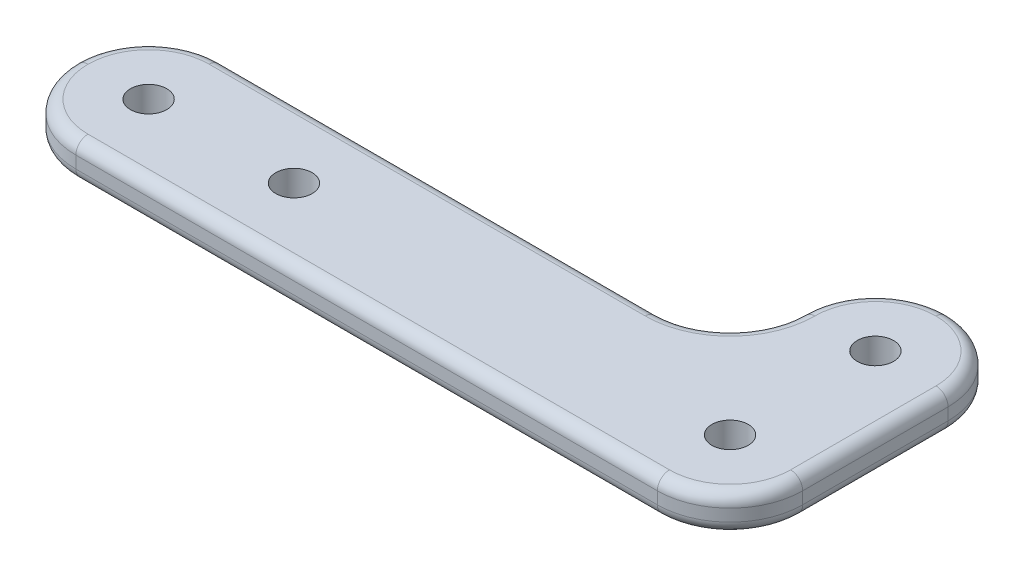
ISO-10303-21;
HEADER;
FILE_DESCRIPTION(('STEP AP214'),'2;1');
FILE_NAME('part.step','',(''),(''),'','','');
FILE_SCHEMA(('AUTOMOTIVE_DESIGN { 1 0 10303 214 1 1 1 1 }'));
ENDSEC;
DATA;
#1=APPLICATION_CONTEXT('core data for automotive mechanical design processes');
#2=APPLICATION_PROTOCOL_DEFINITION('international standard','automotive_design',2000,#1);
#3=PRODUCT_CONTEXT('',#1,'mechanical');
#4=PRODUCT('Part','Part','',(#3));
#5=PRODUCT_RELATED_PRODUCT_CATEGORY('part','',(#4));
#6=PRODUCT_DEFINITION_FORMATION('','',#4);
#7=PRODUCT_DEFINITION_CONTEXT('part definition',#1,'design');
#8=PRODUCT_DEFINITION('design','',#6,#7);
#9=PRODUCT_DEFINITION_SHAPE('','',#8);
#10=(LENGTH_UNIT() NAMED_UNIT(*) SI_UNIT(.MILLI.,.METRE.));
#11=(NAMED_UNIT(*) PLANE_ANGLE_UNIT() SI_UNIT($,.RADIAN.));
#12=(NAMED_UNIT(*) SI_UNIT($,.STERADIAN.) SOLID_ANGLE_UNIT());
#13=UNCERTAINTY_MEASURE_WITH_UNIT(LENGTH_MEASURE(1.E-05),#10,'distance_accuracy_value','');
#14=(GEOMETRIC_REPRESENTATION_CONTEXT(3) GLOBAL_UNCERTAINTY_ASSIGNED_CONTEXT((#13)) GLOBAL_UNIT_ASSIGNED_CONTEXT((#10,
#11,#12)) REPRESENTATION_CONTEXT('',''));
#15=CARTESIAN_POINT('',(0.,0.,0.));
#16=DIRECTION('',(0.,0.,1.));
#17=DIRECTION('',(1.,0.,0.));
#18=AXIS2_PLACEMENT_3D('',#15,#16,#17);
#19=CARTESIAN_POINT('',(0.,6.35,25.4));
#20=DIRECTION('',(0.,0.,-1.));
#21=DIRECTION('',(-1.,0.,0.));
#22=AXIS2_PLACEMENT_3D('',#19,#20,#21);
#23=PLANE('',#22);
#24=DIRECTION('',(0.,-1.,0.));
#25=VECTOR('',#24,1.);
#26=CARTESIAN_POINT('',(-101.6,6.35,25.4000000000004));
#27=LINE('',#26,#25);
#28=CARTESIAN_POINT('',(-101.6,4.23333333333333,25.4000000000004));
#29=VERTEX_POINT('',#28);
#30=CARTESIAN_POINT('',(-101.6,2.11666666666667,25.4000000000004));
#31=VERTEX_POINT('',#30);
#32=EDGE_CURVE('E187',#29,#31,#27,.T.);
#33=ORIENTED_EDGE('',*,*,#32,.T.);
#34=DIRECTION('',(1.,0.,0.));
#35=VECTOR('',#34,1.);
#36=CARTESIAN_POINT('',(0.,2.11666666666667,25.4));
#37=LINE('',#36,#35);
#38=CARTESIAN_POINT('',(0.,2.11666666666667,25.4));
#39=VERTEX_POINT('',#38);
#40=EDGE_CURVE('E233',#31,#39,#37,.T.);
#41=ORIENTED_EDGE('',*,*,#40,.T.);
#42=DIRECTION('',(0.,-1.,0.));
#43=VECTOR('',#42,1.);
#44=CARTESIAN_POINT('',(0.,6.35,25.4));
#45=LINE('',#44,#43);
#46=CARTESIAN_POINT('',(0.,4.23333333333333,25.4));
#47=VERTEX_POINT('',#46);
#48=EDGE_CURVE('E337',#47,#39,#45,.T.);
#49=ORIENTED_EDGE('',*,*,#48,.F.);
#50=DIRECTION('',(1.,0.,0.));
#51=VECTOR('',#50,1.);
#52=CARTESIAN_POINT('',(-101.6,4.23333333333333,25.4000000000004));
#53=LINE('',#52,#51);
#54=EDGE_CURVE('E231',#47,#29,#53,.F.);
#55=ORIENTED_EDGE('',*,*,#54,.T.);
#56=EDGE_LOOP('',(#33,#41,#49,#55));
#57=FACE_BOUND('',#56,.T.);
#58=ADVANCED_FACE('F35',(#57),#23,.F.);
#59=CARTESIAN_POINT('',(0.,6.35,12.7));
#60=DIRECTION('',(0.,-1.,0.));
#61=DIRECTION('',(0.,0.,-1.));
#62=AXIS2_PLACEMENT_3D('',#59,#60,#61);
#63=CYLINDRICAL_SURFACE('',#62,12.7);
#64=ORIENTED_EDGE('',*,*,#48,.T.);
#65=CARTESIAN_POINT('',(0.,2.11666666666667,12.7));
#66=DIRECTION('',(0.,1.,0.));
#67=DIRECTION('',(0.,0.,1.));
#68=AXIS2_PLACEMENT_3D('',#65,#66,#67);
#69=CIRCLE('',#68,12.7);
#70=CARTESIAN_POINT('',(12.7,2.11666666666667,12.7));
#71=VERTEX_POINT('',#70);
#72=EDGE_CURVE('E229',#39,#71,#69,.T.);
#73=ORIENTED_EDGE('',*,*,#72,.T.);
#74=DIRECTION('',(0.,-1.,0.));
#75=VECTOR('',#74,1.);
#76=CARTESIAN_POINT('',(12.7,6.35,12.7));
#77=LINE('',#76,#75);
#78=CARTESIAN_POINT('',(12.7,4.23333333333333,12.7));
#79=VERTEX_POINT('',#78);
#80=EDGE_CURVE('E341',#79,#71,#77,.T.);
#81=ORIENTED_EDGE('',*,*,#80,.F.);
#82=CARTESIAN_POINT('',(0.,4.23333333333333,12.7));
#83=DIRECTION('',(0.,1.,0.));
#84=DIRECTION('',(0.,0.,1.));
#85=AXIS2_PLACEMENT_3D('',#82,#83,#84);
#86=CIRCLE('',#85,12.7);
#87=EDGE_CURVE('E227',#79,#47,#86,.F.);
#88=ORIENTED_EDGE('',*,*,#87,.T.);
#89=EDGE_LOOP('',(#64,#73,#81,#88));
#90=FACE_BOUND('',#89,.T.);
#91=ADVANCED_FACE('F422',(#90),#63,.T.);
#92=CARTESIAN_POINT('',(12.7,6.35,0.));
#93=DIRECTION('',(-1.,0.,0.));
#94=DIRECTION('',(0.,0.,1.));
#95=AXIS2_PLACEMENT_3D('',#92,#93,#94);
#96=PLANE('',#95);
#97=ORIENTED_EDGE('',*,*,#80,.T.);
#98=DIRECTION('',(0.,0.,-1.));
#99=VECTOR('',#98,1.);
#100=CARTESIAN_POINT('',(12.7,2.11666666666667,0.));
#101=LINE('',#100,#99);
#102=CARTESIAN_POINT('',(12.7,2.11666666666667,-12.7));
#103=VERTEX_POINT('',#102);
#104=EDGE_CURVE('E225',#71,#103,#101,.T.);
#105=ORIENTED_EDGE('',*,*,#104,.T.);
#106=DIRECTION('',(0.,-1.,0.));
#107=VECTOR('',#106,1.);
#108=CARTESIAN_POINT('',(12.7,6.35,-12.7));
#109=LINE('',#108,#107);
#110=CARTESIAN_POINT('',(12.7,4.23333333333333,-12.7));
#111=VERTEX_POINT('',#110);
#112=EDGE_CURVE('E190',#103,#111,#109,.F.);
#113=ORIENTED_EDGE('',*,*,#112,.T.);
#114=DIRECTION('',(0.,0.,-1.));
#115=VECTOR('',#114,1.);
#116=CARTESIAN_POINT('',(12.7,4.23333333333333,12.7));
#117=LINE('',#116,#115);
#118=EDGE_CURVE('E223',#111,#79,#117,.F.);
#119=ORIENTED_EDGE('',*,*,#118,.T.);
#120=EDGE_LOOP('',(#97,#105,#113,#119));
#121=FACE_BOUND('',#120,.T.);
#122=ADVANCED_FACE('F428',(#121),#96,.F.);
#123=CARTESIAN_POINT('',(0.,6.35,0.));
#124=DIRECTION('',(0.,0.,1.));
#125=DIRECTION('',(1.,0.,0.));
#126=AXIS2_PLACEMENT_3D('',#123,#124,#125);
#127=PLANE('',#126);
#128=DIRECTION('',(0.,-1.,0.));
#129=VECTOR('',#128,1.);
#130=CARTESIAN_POINT('',(-25.3999999999999,6.35,0.));
#131=LINE('',#130,#129);
#132=CARTESIAN_POINT('',(-25.3999999999999,4.23333333333333,0.));
#133=VERTEX_POINT('',#132);
#134=CARTESIAN_POINT('',(-25.3999999999999,2.11666666666667,0.));
#135=VERTEX_POINT('',#134);
#136=EDGE_CURVE('E336',#133,#135,#131,.T.);
#137=ORIENTED_EDGE('',*,*,#136,.T.);
#138=DIRECTION('',(-1.,0.,0.));
#139=VECTOR('',#138,1.);
#140=CARTESIAN_POINT('',(0.,2.11666666666667,0.));
#141=LINE('',#140,#139);
#142=CARTESIAN_POINT('',(-101.6,2.11666666666667,3.49763620843824E-13));
#143=VERTEX_POINT('',#142);
#144=EDGE_CURVE('E11',#135,#143,#141,.T.);
#145=ORIENTED_EDGE('',*,*,#144,.T.);
#146=DIRECTION('',(0.,-1.,0.));
#147=VECTOR('',#146,1.);
#148=CARTESIAN_POINT('',(-101.6,6.35,3.49763620843824E-13));
#149=LINE('',#148,#147);
#150=CARTESIAN_POINT('',(-101.6,4.23333333333333,3.49763620843824E-13));
#151=VERTEX_POINT('',#150);
#152=EDGE_CURVE('E330',#143,#151,#149,.F.);
#153=ORIENTED_EDGE('',*,*,#152,.T.);
#154=DIRECTION('',(-1.,0.,0.));
#155=VECTOR('',#154,1.);
#156=CARTESIAN_POINT('',(-25.3999999999999,4.23333333333333,0.));
#157=LINE('',#156,#155);
#158=EDGE_CURVE('E44',#151,#133,#157,.F.);
#159=ORIENTED_EDGE('',*,*,#158,.T.);
#160=EDGE_LOOP('',(#137,#145,#153,#159));
#161=FACE_BOUND('',#160,.T.);
#162=ADVANCED_FACE('F334',(#161),#127,.F.);
#163=CARTESIAN_POINT('',(0.,6.35,-12.7));
#164=DIRECTION('',(0.,-1.,0.));
#165=DIRECTION('',(0.,0.,-1.));
#166=AXIS2_PLACEMENT_3D('',#163,#164,#165);
#167=CYLINDRICAL_SURFACE('',#166,3.175);
#168=CARTESIAN_POINT('',(0.,6.35,-12.7));
#169=DIRECTION('',(0.,1.,0.));
#170=DIRECTION('',(0.,0.,1.));
#171=AXIS2_PLACEMENT_3D('',#168,#169,#170);
#172=CIRCLE('',#171,3.175);
#173=CARTESIAN_POINT('',(0.,6.35,-9.52500000000002));
#174=VERTEX_POINT('',#173);
#175=EDGE_CURVE('E376',#174,#174,#172,.T.);
#176=ORIENTED_EDGE('',*,*,#175,.T.);
#177=EDGE_LOOP('',(#176));
#178=FACE_BOUND('',#177,.T.);
#179=CARTESIAN_POINT('',(0.,0.,-12.7));
#180=DIRECTION('',(0.,1.,0.));
#181=DIRECTION('',(0.,0.,1.));
#182=AXIS2_PLACEMENT_3D('',#179,#180,#181);
#183=CIRCLE('',#182,3.175);
#184=CARTESIAN_POINT('',(0.,0.,-9.52500000000002));
#185=VERTEX_POINT('',#184);
#186=EDGE_CURVE('E360',#185,#185,#183,.T.);
#187=ORIENTED_EDGE('',*,*,#186,.F.);
#188=EDGE_LOOP('',(#187));
#189=FACE_BOUND('',#188,.T.);
#190=ADVANCED_FACE('F402',(#178,#189),#167,.F.);
#191=CARTESIAN_POINT('',(-76.2,6.35,12.7000000000003));
#192=DIRECTION('',(0.,-1.,0.));
#193=DIRECTION('',(0.,0.,-1.));
#194=AXIS2_PLACEMENT_3D('',#191,#192,#193);
#195=CYLINDRICAL_SURFACE('',#194,3.175);
#196=CARTESIAN_POINT('',(-76.2,6.35,12.7000000000003));
#197=DIRECTION('',(0.,1.,0.));
#198=DIRECTION('',(0.,0.,1.));
#199=AXIS2_PLACEMENT_3D('',#196,#197,#198);
#200=CIRCLE('',#199,3.175);
#201=CARTESIAN_POINT('',(-76.2,6.35,15.8750000000003));
#202=VERTEX_POINT('',#201);
#203=EDGE_CURVE('E380',#202,#202,#200,.T.);
#204=ORIENTED_EDGE('',*,*,#203,.T.);
#205=EDGE_LOOP('',(#204));
#206=FACE_BOUND('',#205,.T.);
#207=CARTESIAN_POINT('',(-76.2,0.,12.7000000000003));
#208=DIRECTION('',(0.,1.,0.));
#209=DIRECTION('',(0.,0.,1.));
#210=AXIS2_PLACEMENT_3D('',#207,#208,#209);
#211=CIRCLE('',#210,3.175);
#212=CARTESIAN_POINT('',(-76.2,0.,15.8750000000003));
#213=VERTEX_POINT('',#212);
#214=EDGE_CURVE('E356',#213,#213,#211,.T.);
#215=ORIENTED_EDGE('',*,*,#214,.F.);
#216=EDGE_LOOP('',(#215));
#217=FACE_BOUND('',#216,.T.);
#218=ADVANCED_FACE('F399',(#206,#217),#195,.F.);
#219=CARTESIAN_POINT('',(-101.6,6.35,12.7000000000003));
#220=DIRECTION('',(0.,-1.,0.));
#221=DIRECTION('',(0.,0.,-1.));
#222=AXIS2_PLACEMENT_3D('',#219,#220,#221);
#223=CYLINDRICAL_SURFACE('',#222,3.1750000000001);
#224=CARTESIAN_POINT('',(-101.6,6.35,12.7000000000003));
#225=DIRECTION('',(0.,1.,0.));
#226=DIRECTION('',(0.,0.,1.));
#227=AXIS2_PLACEMENT_3D('',#224,#225,#226);
#228=CIRCLE('',#227,3.1750000000001);
#229=CARTESIAN_POINT('',(-101.6,6.35,15.8750000000004));
#230=VERTEX_POINT('',#229);
#231=EDGE_CURVE('E370',#230,#230,#228,.T.);
#232=ORIENTED_EDGE('',*,*,#231,.T.);
#233=EDGE_LOOP('',(#232));
#234=FACE_BOUND('',#233,.T.);
#235=CARTESIAN_POINT('',(-101.6,0.,12.7000000000003));
#236=DIRECTION('',(0.,1.,0.));
#237=DIRECTION('',(0.,0.,1.));
#238=AXIS2_PLACEMENT_3D('',#235,#236,#237);
#239=CIRCLE('',#238,3.1750000000001);
#240=CARTESIAN_POINT('',(-101.6,0.,15.8750000000004));
#241=VERTEX_POINT('',#240);
#242=EDGE_CURVE('E351',#241,#241,#239,.T.);
#243=ORIENTED_EDGE('',*,*,#242,.F.);
#244=EDGE_LOOP('',(#243));
#245=FACE_BOUND('',#244,.T.);
#246=ADVANCED_FACE('F389',(#234,#245),#223,.F.);
#247=CARTESIAN_POINT('',(0.,6.35,12.7));
#248=DIRECTION('',(0.,-1.,0.));
#249=DIRECTION('',(0.,0.,-1.));
#250=AXIS2_PLACEMENT_3D('',#247,#248,#249);
#251=CYLINDRICAL_SURFACE('',#250,3.175);
#252=CARTESIAN_POINT('',(0.,6.35,12.7));
#253=DIRECTION('',(0.,1.,0.));
#254=DIRECTION('',(0.,0.,1.));
#255=AXIS2_PLACEMENT_3D('',#252,#253,#254);
#256=CIRCLE('',#255,3.175);
#257=CARTESIAN_POINT('',(0.,6.35,15.875));
#258=VERTEX_POINT('',#257);
#259=EDGE_CURVE('E363',#258,#258,#256,.T.);
#260=ORIENTED_EDGE('',*,*,#259,.T.);
#261=EDGE_LOOP('',(#260));
#262=FACE_BOUND('',#261,.T.);
#263=CARTESIAN_POINT('',(0.,0.,12.7));
#264=DIRECTION('',(0.,1.,0.));
#265=DIRECTION('',(0.,0.,1.));
#266=AXIS2_PLACEMENT_3D('',#263,#264,#265);
#267=CIRCLE('',#266,3.175);
#268=CARTESIAN_POINT('',(0.,0.,15.875));
#269=VERTEX_POINT('',#268);
#270=EDGE_CURVE('E368',#269,#269,#267,.T.);
#271=ORIENTED_EDGE('',*,*,#270,.F.);
#272=EDGE_LOOP('',(#271));
#273=FACE_BOUND('',#272,.T.);
#274=ADVANCED_FACE('F393',(#262,#273),#251,.F.);
#275=CARTESIAN_POINT('',(0.,6.35,0.));
#276=DIRECTION('',(0.,1.,0.));
#277=DIRECTION('',(0.,0.,1.));
#278=AXIS2_PLACEMENT_3D('',#275,#276,#277);
#279=PLANE('',#278);
#280=CARTESIAN_POINT('',(0.,6.35,-12.7));
#281=DIRECTION('',(0.,1.,0.));
#282=DIRECTION('',(0.,0.,1.));
#283=AXIS2_PLACEMENT_3D('',#280,#281,#282);
#284=CIRCLE('',#283,10.5833333333333);
#285=CARTESIAN_POINT('',(0.,6.35,-23.2833333333334));
#286=VERTEX_POINT('',#285);
#287=CARTESIAN_POINT('',(-10.5833333333333,6.35,-12.7));
#288=VERTEX_POINT('',#287);
#289=EDGE_CURVE('E52',#286,#288,#284,.T.);
#290=ORIENTED_EDGE('',*,*,#289,.T.);
#291=CARTESIAN_POINT('',(-25.4,6.35,-12.6999999999999));
#292=DIRECTION('',(0.,1.,0.));
#293=DIRECTION('',(0.,0.,1.));
#294=AXIS2_PLACEMENT_3D('',#291,#292,#293);
#295=CIRCLE('',#294,14.8166666666667);
#296=CARTESIAN_POINT('',(-25.3999999999999,6.35,2.11666666666674));
#297=VERTEX_POINT('',#296);
#298=EDGE_CURVE('E256',#288,#297,#295,.F.);
#299=ORIENTED_EDGE('',*,*,#298,.T.);
#300=DIRECTION('',(-1.,0.,0.));
#301=VECTOR('',#300,1.);
#302=CARTESIAN_POINT('',(-101.6,6.35,2.11666666666702));
#303=LINE('',#302,#301);
#304=CARTESIAN_POINT('',(-101.6,6.35,2.11666666666702));
#305=VERTEX_POINT('',#304);
#306=EDGE_CURVE('E242',#297,#305,#303,.T.);
#307=ORIENTED_EDGE('',*,*,#306,.T.);
#308=CARTESIAN_POINT('',(-101.6,6.35,12.7000000000003));
#309=DIRECTION('',(0.,1.,0.));
#310=DIRECTION('',(0.,0.,1.));
#311=AXIS2_PLACEMENT_3D('',#308,#309,#310);
#312=CIRCLE('',#311,10.5833333333333);
#313=CARTESIAN_POINT('',(-112.183333333333,6.35,12.7000000000004));
#314=VERTEX_POINT('',#313);
#315=EDGE_CURVE('E244',#305,#314,#312,.T.);
#316=ORIENTED_EDGE('',*,*,#315,.T.);
#317=CARTESIAN_POINT('',(-101.6,6.35,12.7000000000003));
#318=DIRECTION('',(0.,1.,0.));
#319=DIRECTION('',(0.,0.,1.));
#320=AXIS2_PLACEMENT_3D('',#317,#318,#319);
#321=CIRCLE('',#320,10.5833333333333);
#322=CARTESIAN_POINT('',(-101.6,6.35,23.2833333333337));
#323=VERTEX_POINT('',#322);
#324=EDGE_CURVE('E246',#314,#323,#321,.T.);
#325=ORIENTED_EDGE('',*,*,#324,.T.);
#326=DIRECTION('',(1.,0.,0.));
#327=VECTOR('',#326,1.);
#328=CARTESIAN_POINT('',(0.,6.35,23.2833333333333));
#329=LINE('',#328,#327);
#330=CARTESIAN_POINT('',(0.,6.35,23.2833333333333));
#331=VERTEX_POINT('',#330);
#332=EDGE_CURVE('E248',#323,#331,#329,.T.);
#333=ORIENTED_EDGE('',*,*,#332,.T.);
#334=CARTESIAN_POINT('',(0.,6.35,12.7));
#335=DIRECTION('',(0.,1.,0.));
#336=DIRECTION('',(0.,0.,1.));
#337=AXIS2_PLACEMENT_3D('',#334,#335,#336);
#338=CIRCLE('',#337,10.5833333333333);
#339=CARTESIAN_POINT('',(10.5833333333333,6.35,12.7));
#340=VERTEX_POINT('',#339);
#341=EDGE_CURVE('E250',#331,#340,#338,.T.);
#342=ORIENTED_EDGE('',*,*,#341,.T.);
#343=DIRECTION('',(0.,0.,-1.));
#344=VECTOR('',#343,1.);
#345=CARTESIAN_POINT('',(10.5833333333333,6.35,-12.7));
#346=LINE('',#345,#344);
#347=CARTESIAN_POINT('',(10.5833333333333,6.35,-12.7));
#348=VERTEX_POINT('',#347);
#349=EDGE_CURVE('E252',#340,#348,#346,.T.);
#350=ORIENTED_EDGE('',*,*,#349,.T.);
#351=CARTESIAN_POINT('',(0.,6.35,-12.7));
#352=DIRECTION('',(0.,1.,0.));
#353=DIRECTION('',(0.,0.,1.));
#354=AXIS2_PLACEMENT_3D('',#351,#352,#353);
#355=CIRCLE('',#354,10.5833333333333);
#356=EDGE_CURVE('E57',#348,#286,#355,.T.);
#357=ORIENTED_EDGE('',*,*,#356,.T.);
#358=EDGE_LOOP('',(#290,#299,#307,#316,#325,#333,#342,#350,#357));
#359=FACE_BOUND('',#358,.T.);
#360=ORIENTED_EDGE('',*,*,#231,.F.);
#361=EDGE_LOOP('',(#360));
#362=FACE_BOUND('',#361,.T.);
#363=ORIENTED_EDGE('',*,*,#203,.F.);
#364=EDGE_LOOP('',(#363));
#365=FACE_BOUND('',#364,.T.);
#366=ORIENTED_EDGE('',*,*,#175,.F.);
#367=EDGE_LOOP('',(#366));
#368=FACE_BOUND('',#367,.T.);
#369=ORIENTED_EDGE('',*,*,#259,.F.);
#370=EDGE_LOOP('',(#369));
#371=FACE_BOUND('',#370,.T.);
#372=ADVANCED_FACE('F311',(#359,#362,#365,#368,#371),#279,.T.);
#373=CARTESIAN_POINT('',(0.,0.,0.));
#374=DIRECTION('',(0.,1.,0.));
#375=DIRECTION('',(0.,0.,1.));
#376=AXIS2_PLACEMENT_3D('',#373,#374,#375);
#377=PLANE('',#376);
#378=DIRECTION('',(-1.,0.,0.));
#379=VECTOR('',#378,1.);
#380=CARTESIAN_POINT('',(0.,0.,2.11666666666665));
#381=LINE('',#380,#379);
#382=CARTESIAN_POINT('',(-101.6,0.,2.11666666666702));
#383=VERTEX_POINT('',#382);
#384=CARTESIAN_POINT('',(-25.3999999999999,0.,2.11666666666674));
#385=VERTEX_POINT('',#384);
#386=EDGE_CURVE('E166',#383,#385,#381,.F.);
#387=ORIENTED_EDGE('',*,*,#386,.T.);
#388=CARTESIAN_POINT('',(-25.4,0.,-12.6999999999999));
#389=DIRECTION('',(0.,1.,0.));
#390=DIRECTION('',(0.,0.,1.));
#391=AXIS2_PLACEMENT_3D('',#388,#389,#390);
#392=CIRCLE('',#391,14.8166666666667);
#393=CARTESIAN_POINT('',(-10.5833333333333,0.,-12.7));
#394=VERTEX_POINT('',#393);
#395=EDGE_CURVE('E207',#385,#394,#392,.T.);
#396=ORIENTED_EDGE('',*,*,#395,.T.);
#397=CARTESIAN_POINT('',(0.,0.,-12.7));
#398=DIRECTION('',(0.,1.,0.));
#399=DIRECTION('',(0.,0.,1.));
#400=AXIS2_PLACEMENT_3D('',#397,#398,#399);
#401=CIRCLE('',#400,10.5833333333333);
#402=CARTESIAN_POINT('',(0.,0.,-23.2833333333334));
#403=VERTEX_POINT('',#402);
#404=EDGE_CURVE('E205',#394,#403,#401,.F.);
#405=ORIENTED_EDGE('',*,*,#404,.T.);
#406=CARTESIAN_POINT('',(0.,0.,-12.7));
#407=DIRECTION('',(0.,1.,0.));
#408=DIRECTION('',(0.,0.,1.));
#409=AXIS2_PLACEMENT_3D('',#406,#407,#408);
#410=CIRCLE('',#409,10.5833333333333);
#411=CARTESIAN_POINT('',(10.5833333333333,0.,-12.7));
#412=VERTEX_POINT('',#411);
#413=EDGE_CURVE('E203',#403,#412,#410,.F.);
#414=ORIENTED_EDGE('',*,*,#413,.T.);
#415=DIRECTION('',(0.,0.,-1.));
#416=VECTOR('',#415,1.);
#417=CARTESIAN_POINT('',(10.5833333333333,0.,0.));
#418=LINE('',#417,#416);
#419=CARTESIAN_POINT('',(10.5833333333333,0.,12.7));
#420=VERTEX_POINT('',#419);
#421=EDGE_CURVE('E201',#412,#420,#418,.F.);
#422=ORIENTED_EDGE('',*,*,#421,.T.);
#423=CARTESIAN_POINT('',(0.,0.,12.7));
#424=DIRECTION('',(0.,1.,0.));
#425=DIRECTION('',(0.,0.,1.));
#426=AXIS2_PLACEMENT_3D('',#423,#424,#425);
#427=CIRCLE('',#426,10.5833333333333);
#428=CARTESIAN_POINT('',(0.,0.,23.2833333333333));
#429=VERTEX_POINT('',#428);
#430=EDGE_CURVE('E199',#420,#429,#427,.F.);
#431=ORIENTED_EDGE('',*,*,#430,.T.);
#432=DIRECTION('',(1.,0.,0.));
#433=VECTOR('',#432,1.);
#434=CARTESIAN_POINT('',(0.,0.,23.2833333333333));
#435=LINE('',#434,#433);
#436=CARTESIAN_POINT('',(-101.6,0.,23.2833333333337));
#437=VERTEX_POINT('',#436);
#438=EDGE_CURVE('E197',#429,#437,#435,.F.);
#439=ORIENTED_EDGE('',*,*,#438,.T.);
#440=CARTESIAN_POINT('',(-101.6,0.,12.7000000000003));
#441=DIRECTION('',(0.,1.,0.));
#442=DIRECTION('',(0.,0.,1.));
#443=AXIS2_PLACEMENT_3D('',#440,#441,#442);
#444=CIRCLE('',#443,10.5833333333333);
#445=CARTESIAN_POINT('',(-112.183333333333,0.,12.7000000000004));
#446=VERTEX_POINT('',#445);
#447=EDGE_CURVE('E169',#437,#446,#444,.F.);
#448=ORIENTED_EDGE('',*,*,#447,.T.);
#449=CARTESIAN_POINT('',(-101.6,0.,12.7000000000003));
#450=DIRECTION('',(0.,1.,0.));
#451=DIRECTION('',(0.,0.,1.));
#452=AXIS2_PLACEMENT_3D('',#449,#450,#451);
#453=CIRCLE('',#452,10.5833333333333);
#454=EDGE_CURVE('E160',#446,#383,#453,.F.);
#455=ORIENTED_EDGE('',*,*,#454,.T.);
#456=EDGE_LOOP('',(#387,#396,#405,#414,#422,#431,#439,#448,#455));
#457=FACE_BOUND('',#456,.T.);
#458=ORIENTED_EDGE('',*,*,#242,.T.);
#459=EDGE_LOOP('',(#458));
#460=FACE_BOUND('',#459,.T.);
#461=ORIENTED_EDGE('',*,*,#214,.T.);
#462=EDGE_LOOP('',(#461));
#463=FACE_BOUND('',#462,.T.);
#464=ORIENTED_EDGE('',*,*,#186,.T.);
#465=EDGE_LOOP('',(#464));
#466=FACE_BOUND('',#465,.T.);
#467=ORIENTED_EDGE('',*,*,#270,.T.);
#468=EDGE_LOOP('',(#467));
#469=FACE_BOUND('',#468,.T.);
#470=ADVANCED_FACE('F162',(#457,#460,#463,#466,#469),#377,.F.);
#471=CARTESIAN_POINT('',(0.,6.35,-12.7));
#472=DIRECTION('',(0.,1.,0.));
#473=DIRECTION('',(0.,0.,1.));
#474=AXIS2_PLACEMENT_3D('',#471,#472,#473);
#475=CYLINDRICAL_SURFACE('',#474,12.7);
#476=ORIENTED_EDGE('',*,*,#112,.F.);
#477=CARTESIAN_POINT('',(0.,2.11666666666667,-12.7));
#478=DIRECTION('',(0.,1.,0.));
#479=DIRECTION('',(0.,0.,1.));
#480=AXIS2_PLACEMENT_3D('',#477,#478,#479);
#481=CIRCLE('',#480,12.7);
#482=CARTESIAN_POINT('',(0.,2.11666666666667,-25.4));
#483=VERTEX_POINT('',#482);
#484=EDGE_CURVE('E221',#103,#483,#481,.T.);
#485=ORIENTED_EDGE('',*,*,#484,.T.);
#486=DIRECTION('',(0.,-1.,0.));
#487=VECTOR('',#486,1.);
#488=CARTESIAN_POINT('',(0.,0.,-25.4));
#489=LINE('',#488,#487);
#490=CARTESIAN_POINT('',(0.,4.23333333333333,-25.4));
#491=VERTEX_POINT('',#490);
#492=EDGE_CURVE('E349',#491,#483,#489,.T.);
#493=ORIENTED_EDGE('',*,*,#492,.F.);
#494=CARTESIAN_POINT('',(0.,4.23333333333333,-12.7));
#495=DIRECTION('',(0.,1.,0.));
#496=DIRECTION('',(0.,0.,1.));
#497=AXIS2_PLACEMENT_3D('',#494,#495,#496);
#498=CIRCLE('',#497,12.7);
#499=EDGE_CURVE('E219',#491,#111,#498,.F.);
#500=ORIENTED_EDGE('',*,*,#499,.T.);
#501=EDGE_LOOP('',(#476,#485,#493,#500));
#502=FACE_BOUND('',#501,.T.);
#503=ADVANCED_FACE('F408',(#502),#475,.T.);
#504=CARTESIAN_POINT('',(0.,6.35,-12.7));
#505=DIRECTION('',(0.,-1.,0.));
#506=DIRECTION('',(0.,0.,-1.));
#507=AXIS2_PLACEMENT_3D('',#504,#505,#506);
#508=CYLINDRICAL_SURFACE('',#507,12.7);
#509=ORIENTED_EDGE('',*,*,#492,.T.);
#510=CARTESIAN_POINT('',(0.,2.11666666666667,-12.7));
#511=DIRECTION('',(0.,1.,0.));
#512=DIRECTION('',(0.,0.,1.));
#513=AXIS2_PLACEMENT_3D('',#510,#511,#512);
#514=CIRCLE('',#513,12.7);
#515=CARTESIAN_POINT('',(-12.7,2.11666666666667,-12.7));
#516=VERTEX_POINT('',#515);
#517=EDGE_CURVE('E217',#483,#516,#514,.T.);
#518=ORIENTED_EDGE('',*,*,#517,.T.);
#519=DIRECTION('',(0.,-1.,0.));
#520=VECTOR('',#519,1.);
#521=CARTESIAN_POINT('',(-12.7,6.35,-12.7));
#522=LINE('',#521,#520);
#523=CARTESIAN_POINT('',(-12.7,4.23333333333333,-12.7));
#524=VERTEX_POINT('',#523);
#525=EDGE_CURVE('E347',#524,#516,#522,.T.);
#526=ORIENTED_EDGE('',*,*,#525,.F.);
#527=CARTESIAN_POINT('',(0.,4.23333333333333,-12.7));
#528=DIRECTION('',(0.,1.,0.));
#529=DIRECTION('',(0.,0.,1.));
#530=AXIS2_PLACEMENT_3D('',#527,#528,#529);
#531=CIRCLE('',#530,12.7);
#532=EDGE_CURVE('E215',#524,#491,#531,.F.);
#533=ORIENTED_EDGE('',*,*,#532,.T.);
#534=EDGE_LOOP('',(#509,#518,#526,#533));
#535=FACE_BOUND('',#534,.T.);
#536=ADVANCED_FACE('F437',(#535),#508,.T.);
#537=CARTESIAN_POINT('',(-25.4,6.35,-12.6999999999999));
#538=DIRECTION('',(0.,-1.,0.));
#539=DIRECTION('',(0.,0.,-1.));
#540=AXIS2_PLACEMENT_3D('',#537,#538,#539);
#541=CYLINDRICAL_SURFACE('',#540,12.7);
#542=ORIENTED_EDGE('',*,*,#525,.T.);
#543=CARTESIAN_POINT('',(-25.4,2.11666666666667,-12.6999999999999));
#544=DIRECTION('',(0.,1.,0.));
#545=DIRECTION('',(0.,0.,1.));
#546=AXIS2_PLACEMENT_3D('',#543,#544,#545);
#547=CIRCLE('',#546,12.7);
#548=EDGE_CURVE('E212',#516,#135,#547,.F.);
#549=ORIENTED_EDGE('',*,*,#548,.T.);
#550=ORIENTED_EDGE('',*,*,#136,.F.);
#551=CARTESIAN_POINT('',(-25.4,4.23333333333333,-12.6999999999999));
#552=DIRECTION('',(0.,1.,0.));
#553=DIRECTION('',(0.,0.,1.));
#554=AXIS2_PLACEMENT_3D('',#551,#552,#553);
#555=CIRCLE('',#554,12.7);
#556=EDGE_CURVE('E209',#133,#524,#555,.T.);
#557=ORIENTED_EDGE('',*,*,#556,.T.);
#558=EDGE_LOOP('',(#542,#549,#550,#557));
#559=FACE_BOUND('',#558,.T.);
#560=ADVANCED_FACE('F433',(#559),#541,.F.);
#561=CARTESIAN_POINT('',(-101.6,6.35,12.7000000000003));
#562=DIRECTION('',(0.,-1.,0.));
#563=DIRECTION('',(0.,0.,-1.));
#564=AXIS2_PLACEMENT_3D('',#561,#562,#563);
#565=CYLINDRICAL_SURFACE('',#564,12.7);
#566=DIRECTION('',(0.,-1.,0.));
#567=VECTOR('',#566,1.);
#568=CARTESIAN_POINT('',(-114.3,6.35,12.7000000000004));
#569=LINE('',#568,#567);
#570=CARTESIAN_POINT('',(-114.3,2.11666666666667,12.7000000000004));
#571=VERTEX_POINT('',#570);
#572=CARTESIAN_POINT('',(-114.3,4.23333333333333,12.7000000000004));
#573=VERTEX_POINT('',#572);
#574=EDGE_CURVE('E193',#571,#573,#569,.F.);
#575=ORIENTED_EDGE('',*,*,#574,.F.);
#576=CARTESIAN_POINT('',(-101.6,2.11666666666667,12.7000000000003));
#577=DIRECTION('',(0.,1.,0.));
#578=DIRECTION('',(0.,0.,1.));
#579=AXIS2_PLACEMENT_3D('',#576,#577,#578);
#580=CIRCLE('',#579,12.7);
#581=EDGE_CURVE('E237',#571,#31,#580,.T.);
#582=ORIENTED_EDGE('',*,*,#581,.T.);
#583=ORIENTED_EDGE('',*,*,#32,.F.);
#584=CARTESIAN_POINT('',(-101.6,4.23333333333333,12.7000000000003));
#585=DIRECTION('',(0.,1.,0.));
#586=DIRECTION('',(0.,0.,1.));
#587=AXIS2_PLACEMENT_3D('',#584,#585,#586);
#588=CIRCLE('',#587,12.7);
#589=EDGE_CURVE('E235',#29,#573,#588,.F.);
#590=ORIENTED_EDGE('',*,*,#589,.T.);
#591=EDGE_LOOP('',(#575,#582,#583,#590));
#592=FACE_BOUND('',#591,.T.);
#593=ADVANCED_FACE('F436',(#592),#565,.T.);
#594=CARTESIAN_POINT('',(-101.6,6.35,12.7000000000003));
#595=DIRECTION('',(0.,-1.,0.));
#596=DIRECTION('',(0.,0.,-1.));
#597=AXIS2_PLACEMENT_3D('',#594,#595,#596);
#598=CYLINDRICAL_SURFACE('',#597,12.7);
#599=ORIENTED_EDGE('',*,*,#152,.F.);
#600=CARTESIAN_POINT('',(-101.6,2.11666666666667,12.7000000000003));
#601=DIRECTION('',(0.,1.,0.));
#602=DIRECTION('',(0.,0.,1.));
#603=AXIS2_PLACEMENT_3D('',#600,#601,#602);
#604=CIRCLE('',#603,12.7);
#605=EDGE_CURVE('E178',#143,#571,#604,.T.);
#606=ORIENTED_EDGE('',*,*,#605,.T.);
#607=ORIENTED_EDGE('',*,*,#574,.T.);
#608=CARTESIAN_POINT('',(-101.6,4.23333333333333,12.7000000000003));
#609=DIRECTION('',(0.,1.,0.));
#610=DIRECTION('',(0.,0.,1.));
#611=AXIS2_PLACEMENT_3D('',#608,#609,#610);
#612=CIRCLE('',#611,12.7);
#613=EDGE_CURVE('E239',#573,#151,#612,.F.);
#614=ORIENTED_EDGE('',*,*,#613,.T.);
#615=EDGE_LOOP('',(#599,#606,#607,#614));
#616=FACE_BOUND('',#615,.T.);
#617=ADVANCED_FACE('F329',(#616),#598,.T.);
#618=CARTESIAN_POINT('',(0.,2.11666666666667,23.2833333333333));
#619=DIRECTION('',(1.,0.,0.));
#620=DIRECTION('',(0.,0.,-1.));
#621=AXIS2_PLACEMENT_3D('',#618,#619,#620);
#622=CYLINDRICAL_SURFACE('',#621,2.11666666666667);
#623=CARTESIAN_POINT('',(-101.6,2.11666666666667,23.2833333333337));
#624=DIRECTION('',(-1.,0.,0.));
#625=DIRECTION('',(0.,0.,1.));
#626=AXIS2_PLACEMENT_3D('',#623,#624,#625);
#627=CIRCLE('',#626,2.11666666666667);
#628=EDGE_CURVE('E271',#437,#31,#627,.T.);
#629=ORIENTED_EDGE('',*,*,#628,.F.);
#630=ORIENTED_EDGE('',*,*,#438,.F.);
#631=CARTESIAN_POINT('',(0.,2.11666666666667,23.2833333333333));
#632=DIRECTION('',(1.,0.,0.));
#633=DIRECTION('',(0.,0.,-1.));
#634=AXIS2_PLACEMENT_3D('',#631,#632,#633);
#635=CIRCLE('',#634,2.11666666666667);
#636=EDGE_CURVE('E274',#39,#429,#635,.T.);
#637=ORIENTED_EDGE('',*,*,#636,.F.);
#638=ORIENTED_EDGE('',*,*,#40,.F.);
#639=EDGE_LOOP('',(#629,#630,#637,#638));
#640=FACE_BOUND('',#639,.T.);
#641=ADVANCED_FACE('F446',(#640),#622,.T.);
#642=CARTESIAN_POINT('',(0.,2.11666666666667,12.7));
#643=DIRECTION('',(0.,1.,0.));
#644=DIRECTION('',(0.,0.,1.));
#645=AXIS2_PLACEMENT_3D('',#642,#643,#644);
#646=TOROIDAL_SURFACE('',#645,10.5833333333333,2.11666666666667);
#647=ORIENTED_EDGE('',*,*,#636,.T.);
#648=ORIENTED_EDGE('',*,*,#430,.F.);
#649=CARTESIAN_POINT('',(10.5833333333333,2.11666666666667,12.7));
#650=DIRECTION('',(0.,0.,-1.));
#651=DIRECTION('',(-1.,0.,0.));
#652=AXIS2_PLACEMENT_3D('',#649,#650,#651);
#653=CIRCLE('',#652,2.11666666666667);
#654=EDGE_CURVE('E268',#71,#420,#653,.T.);
#655=ORIENTED_EDGE('',*,*,#654,.F.);
#656=ORIENTED_EDGE('',*,*,#72,.F.);
#657=EDGE_LOOP('',(#647,#648,#655,#656));
#658=FACE_BOUND('',#657,.T.);
#659=ADVANCED_FACE('F473',(#658),#646,.T.);
#660=CARTESIAN_POINT('',(-101.6,2.11666666666667,12.7000000000003));
#661=DIRECTION('',(0.,1.,0.));
#662=DIRECTION('',(0.,0.,1.));
#663=AXIS2_PLACEMENT_3D('',#660,#661,#662);
#664=TOROIDAL_SURFACE('',#663,10.5833333333333,2.11666666666667);
#665=ORIENTED_EDGE('',*,*,#628,.T.);
#666=ORIENTED_EDGE('',*,*,#581,.F.);
#667=CARTESIAN_POINT('',(-112.183333333333,2.11666666666667,12.7000000000004));
#668=DIRECTION('',(0.,0.,-1.));
#669=DIRECTION('',(-1.,0.,0.));
#670=AXIS2_PLACEMENT_3D('',#667,#668,#669);
#671=CIRCLE('',#670,2.11666666666667);
#672=EDGE_CURVE('E266',#446,#571,#671,.T.);
#673=ORIENTED_EDGE('',*,*,#672,.F.);
#674=ORIENTED_EDGE('',*,*,#447,.F.);
#675=EDGE_LOOP('',(#665,#666,#673,#674));
#676=FACE_BOUND('',#675,.T.);
#677=ADVANCED_FACE('F469',(#676),#664,.T.);
#678=CARTESIAN_POINT('',(10.5833333333333,2.11666666666667,0.));
#679=DIRECTION('',(0.,0.,-1.));
#680=DIRECTION('',(-1.,0.,0.));
#681=AXIS2_PLACEMENT_3D('',#678,#679,#680);
#682=CYLINDRICAL_SURFACE('',#681,2.11666666666667);
#683=ORIENTED_EDGE('',*,*,#654,.T.);
#684=ORIENTED_EDGE('',*,*,#421,.F.);
#685=CARTESIAN_POINT('',(10.5833333333333,2.11666666666667,-12.7));
#686=DIRECTION('',(0.,0.,-1.));
#687=DIRECTION('',(-1.,0.,0.));
#688=AXIS2_PLACEMENT_3D('',#685,#686,#687);
#689=CIRCLE('',#688,2.11666666666667);
#690=EDGE_CURVE('E181',#103,#412,#689,.T.);
#691=ORIENTED_EDGE('',*,*,#690,.F.);
#692=ORIENTED_EDGE('',*,*,#104,.F.);
#693=EDGE_LOOP('',(#683,#684,#691,#692));
#694=FACE_BOUND('',#693,.T.);
#695=ADVANCED_FACE('F466',(#694),#682,.T.);
#696=CARTESIAN_POINT('',(-101.6,2.11666666666667,12.7000000000003));
#697=DIRECTION('',(0.,1.,0.));
#698=DIRECTION('',(0.,0.,1.));
#699=AXIS2_PLACEMENT_3D('',#696,#697,#698);
#700=TOROIDAL_SURFACE('',#699,10.5833333333333,2.11666666666667);
#701=ORIENTED_EDGE('',*,*,#672,.T.);
#702=ORIENTED_EDGE('',*,*,#605,.F.);
#703=CARTESIAN_POINT('',(-101.6,2.11666666666667,2.11666666666702));
#704=DIRECTION('',(1.,0.,0.));
#705=DIRECTION('',(0.,0.,-1.));
#706=AXIS2_PLACEMENT_3D('',#703,#704,#705);
#707=CIRCLE('',#706,2.11666666666667);
#708=EDGE_CURVE('E176',#383,#143,#707,.T.);
#709=ORIENTED_EDGE('',*,*,#708,.F.);
#710=ORIENTED_EDGE('',*,*,#454,.F.);
#711=EDGE_LOOP('',(#701,#702,#709,#710));
#712=FACE_BOUND('',#711,.T.);
#713=ADVANCED_FACE('F177',(#712),#700,.T.);
#714=CARTESIAN_POINT('',(0.,2.11666666666667,-12.7));
#715=DIRECTION('',(0.,1.,0.));
#716=DIRECTION('',(0.,0.,1.));
#717=AXIS2_PLACEMENT_3D('',#714,#715,#716);
#718=TOROIDAL_SURFACE('',#717,10.5833333333333,2.11666666666667);
#719=ORIENTED_EDGE('',*,*,#690,.T.);
#720=ORIENTED_EDGE('',*,*,#413,.F.);
#721=CARTESIAN_POINT('',(0.,2.11666666666667,-23.2833333333334));
#722=DIRECTION('',(-1.,0.,0.));
#723=DIRECTION('',(0.,-1.,0.));
#724=AXIS2_PLACEMENT_3D('',#721,#722,#723);
#725=CIRCLE('',#724,2.11666666666667);
#726=EDGE_CURVE('E182',#483,#403,#725,.T.);
#727=ORIENTED_EDGE('',*,*,#726,.F.);
#728=ORIENTED_EDGE('',*,*,#484,.F.);
#729=EDGE_LOOP('',(#719,#720,#727,#728));
#730=FACE_BOUND('',#729,.T.);
#731=ADVANCED_FACE('F460',(#730),#718,.T.);
#732=CARTESIAN_POINT('',(0.,2.11666666666667,2.11666666666665));
#733=DIRECTION('',(-1.,0.,0.));
#734=DIRECTION('',(0.,0.,1.));
#735=AXIS2_PLACEMENT_3D('',#732,#733,#734);
#736=CYLINDRICAL_SURFACE('',#735,2.11666666666667);
#737=ORIENTED_EDGE('',*,*,#708,.T.);
#738=ORIENTED_EDGE('',*,*,#144,.F.);
#739=CARTESIAN_POINT('',(-25.3999999999999,2.11666666666667,2.11666666666674));
#740=DIRECTION('',(1.,0.,0.));
#741=DIRECTION('',(0.,0.,-1.));
#742=AXIS2_PLACEMENT_3D('',#739,#740,#741);
#743=CIRCLE('',#742,2.11666666666667);
#744=EDGE_CURVE('E185',#385,#135,#743,.T.);
#745=ORIENTED_EDGE('',*,*,#744,.F.);
#746=ORIENTED_EDGE('',*,*,#386,.F.);
#747=EDGE_LOOP('',(#737,#738,#745,#746));
#748=FACE_BOUND('',#747,.T.);
#749=ADVANCED_FACE('F184',(#748),#736,.T.);
#750=CARTESIAN_POINT('',(0.,2.11666666666667,-12.7));
#751=DIRECTION('',(0.,1.,0.));
#752=DIRECTION('',(0.,0.,1.));
#753=AXIS2_PLACEMENT_3D('',#750,#751,#752);
#754=TOROIDAL_SURFACE('',#753,10.5833333333333,2.11666666666667);
#755=ORIENTED_EDGE('',*,*,#726,.T.);
#756=ORIENTED_EDGE('',*,*,#404,.F.);
#757=CARTESIAN_POINT('',(-10.5833333333333,2.11666666666667,-12.7));
#758=DIRECTION('',(0.,0.,1.));
#759=DIRECTION('',(0.,-1.,0.));
#760=AXIS2_PLACEMENT_3D('',#757,#758,#759);
#761=CIRCLE('',#760,2.11666666666667);
#762=EDGE_CURVE('E259',#516,#394,#761,.T.);
#763=ORIENTED_EDGE('',*,*,#762,.F.);
#764=ORIENTED_EDGE('',*,*,#517,.F.);
#765=EDGE_LOOP('',(#755,#756,#763,#764));
#766=FACE_BOUND('',#765,.T.);
#767=ADVANCED_FACE('F453',(#766),#754,.T.);
#768=CARTESIAN_POINT('',(-25.4,2.11666666666667,-12.6999999999999));
#769=DIRECTION('',(0.,1.,0.));
#770=DIRECTION('',(0.,0.,1.));
#771=AXIS2_PLACEMENT_3D('',#768,#769,#770);
#772=TOROIDAL_SURFACE('',#771,14.8166666666667,2.11666666666667);
#773=ORIENTED_EDGE('',*,*,#744,.T.);
#774=ORIENTED_EDGE('',*,*,#548,.F.);
#775=ORIENTED_EDGE('',*,*,#762,.T.);
#776=ORIENTED_EDGE('',*,*,#395,.F.);
#777=EDGE_LOOP('',(#773,#774,#775,#776));
#778=FACE_BOUND('',#777,.T.);
#779=ADVANCED_FACE('F450',(#778),#772,.T.);
#780=CARTESIAN_POINT('',(0.,4.23333333333333,12.7));
#781=DIRECTION('',(0.,1.,0.));
#782=DIRECTION('',(0.,0.,1.));
#783=AXIS2_PLACEMENT_3D('',#780,#781,#782);
#784=TOROIDAL_SURFACE('',#783,10.5833333333333,2.11666666666667);
#785=CARTESIAN_POINT('',(10.5833333333333,4.23333333333333,12.7));
#786=DIRECTION('',(0.,0.,-1.));
#787=DIRECTION('',(-1.,0.,0.));
#788=AXIS2_PLACEMENT_3D('',#785,#786,#787);
#789=CIRCLE('',#788,2.11666666666667);
#790=EDGE_CURVE('E295',#340,#79,#789,.T.);
#791=ORIENTED_EDGE('',*,*,#790,.F.);
#792=ORIENTED_EDGE('',*,*,#341,.F.);
#793=CARTESIAN_POINT('',(0.,4.23333333333333,23.2833333333333));
#794=DIRECTION('',(-1.,0.,0.));
#795=DIRECTION('',(0.,0.,1.));
#796=AXIS2_PLACEMENT_3D('',#793,#794,#795);
#797=CIRCLE('',#796,2.11666666666667);
#798=EDGE_CURVE('E39',#47,#331,#797,.T.);
#799=ORIENTED_EDGE('',*,*,#798,.F.);
#800=ORIENTED_EDGE('',*,*,#87,.F.);
#801=EDGE_LOOP('',(#791,#792,#799,#800));
#802=FACE_BOUND('',#801,.T.);
#803=ADVANCED_FACE('F37',(#802),#784,.T.);
#804=CARTESIAN_POINT('',(0.,4.23333333333333,23.2833333333333));
#805=DIRECTION('',(-1.,0.,0.));
#806=DIRECTION('',(0.,0.,1.));
#807=AXIS2_PLACEMENT_3D('',#804,#805,#806);
#808=CYLINDRICAL_SURFACE('',#807,2.11666666666667);
#809=ORIENTED_EDGE('',*,*,#798,.T.);
#810=ORIENTED_EDGE('',*,*,#332,.F.);
#811=CARTESIAN_POINT('',(-101.6,4.23333333333333,23.2833333333337));
#812=DIRECTION('',(-1.,0.,0.));
#813=DIRECTION('',(0.,0.,1.));
#814=AXIS2_PLACEMENT_3D('',#811,#812,#813);
#815=CIRCLE('',#814,2.11666666666667);
#816=EDGE_CURVE('E293',#29,#323,#815,.T.);
#817=ORIENTED_EDGE('',*,*,#816,.F.);
#818=ORIENTED_EDGE('',*,*,#54,.F.);
#819=EDGE_LOOP('',(#809,#810,#817,#818));
#820=FACE_BOUND('',#819,.T.);
#821=ADVANCED_FACE('F306',(#820),#808,.T.);
#822=CARTESIAN_POINT('',(10.5833333333333,4.23333333333333,0.));
#823=DIRECTION('',(0.,0.,1.));
#824=DIRECTION('',(1.,0.,0.));
#825=AXIS2_PLACEMENT_3D('',#822,#823,#824);
#826=CYLINDRICAL_SURFACE('',#825,2.11666666666667);
#827=ORIENTED_EDGE('',*,*,#790,.T.);
#828=ORIENTED_EDGE('',*,*,#118,.F.);
#829=CARTESIAN_POINT('',(10.5833333333333,4.23333333333333,-12.7));
#830=DIRECTION('',(0.,0.,-1.));
#831=DIRECTION('',(-1.,0.,0.));
#832=AXIS2_PLACEMENT_3D('',#829,#830,#831);
#833=CIRCLE('',#832,2.11666666666667);
#834=EDGE_CURVE('E290',#348,#111,#833,.T.);
#835=ORIENTED_EDGE('',*,*,#834,.F.);
#836=ORIENTED_EDGE('',*,*,#349,.F.);
#837=EDGE_LOOP('',(#827,#828,#835,#836));
#838=FACE_BOUND('',#837,.T.);
#839=ADVANCED_FACE('F501',(#838),#826,.T.);
#840=CARTESIAN_POINT('',(-101.6,4.23333333333333,12.7000000000003));
#841=DIRECTION('',(0.,1.,0.));
#842=DIRECTION('',(0.,0.,1.));
#843=AXIS2_PLACEMENT_3D('',#840,#841,#842);
#844=TOROIDAL_SURFACE('',#843,10.5833333333333,2.11666666666667);
#845=ORIENTED_EDGE('',*,*,#816,.T.);
#846=ORIENTED_EDGE('',*,*,#324,.F.);
#847=CARTESIAN_POINT('',(-112.183333333333,4.23333333333333,12.7000000000004));
#848=DIRECTION('',(0.,0.,-1.));
#849=DIRECTION('',(-1.,0.,0.));
#850=AXIS2_PLACEMENT_3D('',#847,#848,#849);
#851=CIRCLE('',#850,2.11666666666667);
#852=EDGE_CURVE('E287',#573,#314,#851,.T.);
#853=ORIENTED_EDGE('',*,*,#852,.F.);
#854=ORIENTED_EDGE('',*,*,#589,.F.);
#855=EDGE_LOOP('',(#845,#846,#853,#854));
#856=FACE_BOUND('',#855,.T.);
#857=ADVANCED_FACE('F318',(#856),#844,.T.);
#858=CARTESIAN_POINT('',(0.,4.23333333333333,-12.7));
#859=DIRECTION('',(0.,1.,0.));
#860=DIRECTION('',(0.,0.,1.));
#861=AXIS2_PLACEMENT_3D('',#858,#859,#860);
#862=TOROIDAL_SURFACE('',#861,10.5833333333333,2.11666666666667);
#863=ORIENTED_EDGE('',*,*,#834,.T.);
#864=ORIENTED_EDGE('',*,*,#499,.F.);
#865=CARTESIAN_POINT('',(0.,4.23333333333333,-23.2833333333334));
#866=DIRECTION('',(-1.,0.,0.));
#867=DIRECTION('',(0.,0.,1.));
#868=AXIS2_PLACEMENT_3D('',#865,#866,#867);
#869=CIRCLE('',#868,2.11666666666667);
#870=EDGE_CURVE('E284',#286,#491,#869,.T.);
#871=ORIENTED_EDGE('',*,*,#870,.F.);
#872=ORIENTED_EDGE('',*,*,#356,.F.);
#873=EDGE_LOOP('',(#863,#864,#871,#872));
#874=FACE_BOUND('',#873,.T.);
#875=ADVANCED_FACE('F495',(#874),#862,.T.);
#876=CARTESIAN_POINT('',(-101.6,4.23333333333333,12.7000000000003));
#877=DIRECTION('',(0.,1.,0.));
#878=DIRECTION('',(0.,0.,1.));
#879=AXIS2_PLACEMENT_3D('',#876,#877,#878);
#880=TOROIDAL_SURFACE('',#879,10.5833333333333,2.11666666666667);
#881=ORIENTED_EDGE('',*,*,#852,.T.);
#882=ORIENTED_EDGE('',*,*,#315,.F.);
#883=CARTESIAN_POINT('',(-101.6,4.23333333333333,2.11666666666702));
#884=DIRECTION('',(1.,0.,0.));
#885=DIRECTION('',(0.,0.,-1.));
#886=AXIS2_PLACEMENT_3D('',#883,#884,#885);
#887=CIRCLE('',#886,2.11666666666667);
#888=EDGE_CURVE('E281',#151,#305,#887,.T.);
#889=ORIENTED_EDGE('',*,*,#888,.F.);
#890=ORIENTED_EDGE('',*,*,#613,.F.);
#891=EDGE_LOOP('',(#881,#882,#889,#890));
#892=FACE_BOUND('',#891,.T.);
#893=ADVANCED_FACE('F322',(#892),#880,.T.);
#894=CARTESIAN_POINT('',(0.,4.23333333333333,-12.7));
#895=DIRECTION('',(0.,1.,0.));
#896=DIRECTION('',(0.,0.,1.));
#897=AXIS2_PLACEMENT_3D('',#894,#895,#896);
#898=TOROIDAL_SURFACE('',#897,10.5833333333333,2.11666666666667);
#899=ORIENTED_EDGE('',*,*,#870,.T.);
#900=ORIENTED_EDGE('',*,*,#532,.F.);
#901=CARTESIAN_POINT('',(-10.5833333333333,4.23333333333333,-12.7));
#902=DIRECTION('',(0.,0.,1.));
#903=DIRECTION('',(1.,0.,0.));
#904=AXIS2_PLACEMENT_3D('',#901,#902,#903);
#905=CIRCLE('',#904,2.11666666666667);
#906=EDGE_CURVE('E279',#288,#524,#905,.T.);
#907=ORIENTED_EDGE('',*,*,#906,.F.);
#908=ORIENTED_EDGE('',*,*,#289,.F.);
#909=EDGE_LOOP('',(#899,#900,#907,#908));
#910=FACE_BOUND('',#909,.T.);
#911=ADVANCED_FACE('F488',(#910),#898,.T.);
#912=CARTESIAN_POINT('',(0.,4.23333333333333,2.11666666666665));
#913=DIRECTION('',(1.,0.,0.));
#914=DIRECTION('',(0.,0.,-1.));
#915=AXIS2_PLACEMENT_3D('',#912,#913,#914);
#916=CYLINDRICAL_SURFACE('',#915,2.11666666666667);
#917=ORIENTED_EDGE('',*,*,#888,.T.);
#918=ORIENTED_EDGE('',*,*,#306,.F.);
#919=CARTESIAN_POINT('',(-25.3999999999999,4.23333333333333,2.11666666666674));
#920=DIRECTION('',(1.,0.,0.));
#921=DIRECTION('',(0.,0.,-1.));
#922=AXIS2_PLACEMENT_3D('',#919,#920,#921);
#923=CIRCLE('',#922,2.11666666666667);
#924=EDGE_CURVE('E277',#133,#297,#923,.T.);
#925=ORIENTED_EDGE('',*,*,#924,.F.);
#926=ORIENTED_EDGE('',*,*,#158,.F.);
#927=EDGE_LOOP('',(#917,#918,#925,#926));
#928=FACE_BOUND('',#927,.T.);
#929=ADVANCED_FACE('F484',(#928),#916,.T.);
#930=CARTESIAN_POINT('',(-25.4,4.23333333333333,-12.6999999999999));
#931=DIRECTION('',(0.,1.,0.));
#932=DIRECTION('',(0.,0.,1.));
#933=AXIS2_PLACEMENT_3D('',#930,#931,#932);
#934=TOROIDAL_SURFACE('',#933,14.8166666666667,2.11666666666667);
#935=ORIENTED_EDGE('',*,*,#906,.T.);
#936=ORIENTED_EDGE('',*,*,#556,.F.);
#937=ORIENTED_EDGE('',*,*,#924,.T.);
#938=ORIENTED_EDGE('',*,*,#298,.F.);
#939=EDGE_LOOP('',(#935,#936,#937,#938));
#940=FACE_BOUND('',#939,.T.);
#941=ADVANCED_FACE('F481',(#940),#934,.T.);
#942=CLOSED_SHELL('',(#58,#91,#122,#162,#190,#218,#246,#274,#372,#470,#503,#536,#560,#593,#617,
#641,#659,#677,#695,#713,#731,#749,#767,#779,#803,#821,#839,#857,#875,#893,#911,#929,#941));
#943=MANIFOLD_SOLID_BREP('B2',#942);
#944=ADVANCED_BREP_SHAPE_REPRESENTATION('',(#18,#943),#14);
#945=SHAPE_DEFINITION_REPRESENTATION(#9,#944);
ENDSEC;
END-ISO-10303-21;
